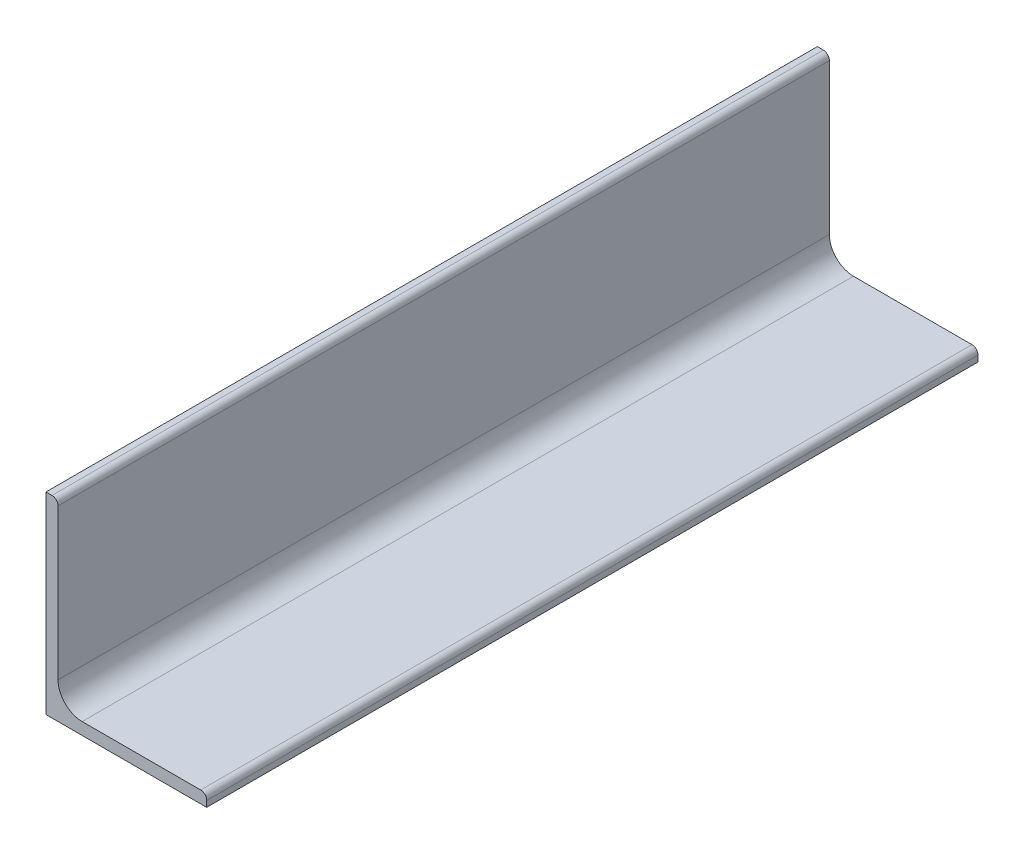
ISO-10303-21;
HEADER;
FILE_DESCRIPTION(('STEP AP214'),'2;1');
FILE_NAME('part.step','',(''),(''),'','','');
FILE_SCHEMA(('AUTOMOTIVE_DESIGN { 1 0 10303 214 1 1 1 1 }'));
ENDSEC;
DATA;
#1=APPLICATION_CONTEXT('core data for automotive mechanical design processes');
#2=APPLICATION_PROTOCOL_DEFINITION('international standard','automotive_design',2000,#1);
#3=PRODUCT_CONTEXT('',#1,'mechanical');
#4=PRODUCT('Part','Part','',(#3));
#5=PRODUCT_RELATED_PRODUCT_CATEGORY('part','',(#4));
#6=PRODUCT_DEFINITION_FORMATION('','',#4);
#7=PRODUCT_DEFINITION_CONTEXT('part definition',#1,'design');
#8=PRODUCT_DEFINITION('design','',#6,#7);
#9=PRODUCT_DEFINITION_SHAPE('','',#8);
#10=(LENGTH_UNIT() NAMED_UNIT(*) SI_UNIT(.MILLI.,.METRE.));
#11=(NAMED_UNIT(*) PLANE_ANGLE_UNIT() SI_UNIT($,.RADIAN.));
#12=(NAMED_UNIT(*) SI_UNIT($,.STERADIAN.) SOLID_ANGLE_UNIT());
#13=UNCERTAINTY_MEASURE_WITH_UNIT(LENGTH_MEASURE(1.E-05),#10,'distance_accuracy_value','');
#14=(GEOMETRIC_REPRESENTATION_CONTEXT(3) GLOBAL_UNCERTAINTY_ASSIGNED_CONTEXT((#13)) GLOBAL_UNIT_ASSIGNED_CONTEXT((#10,
#11,#12)) REPRESENTATION_CONTEXT('',''));
#15=CARTESIAN_POINT('',(0.,0.,0.));
#16=DIRECTION('',(0.,0.,1.));
#17=DIRECTION('',(1.,0.,0.));
#18=AXIS2_PLACEMENT_3D('',#15,#16,#17);
#19=CARTESIAN_POINT('',(0.897927251325018,76.2882459217981,304.8));
#20=DIRECTION('',(1.,0.,0.));
#21=DIRECTION('',(0.,0.,-1.));
#22=AXIS2_PLACEMENT_3D('',#19,#20,#21);
#23=PLANE('',#22);
#24=DIRECTION('',(0.,-1.,0.));
#25=VECTOR('',#24,1.);
#26=CARTESIAN_POINT('',(0.897927251325018,76.2882459217981,0.));
#27=LINE('',#26,#25);
#28=CARTESIAN_POINT('',(0.897927251325018,76.2882459217981,0.));
#29=VERTEX_POINT('',#28);
#30=CARTESIAN_POINT('',(0.897927251325018,0.0882459217980795,0.));
#31=VERTEX_POINT('',#30);
#32=EDGE_CURVE('E135',#29,#31,#27,.T.);
#33=ORIENTED_EDGE('',*,*,#32,.T.);
#34=DIRECTION('',(0.,0.,-1.));
#35=VECTOR('',#34,1.);
#36=CARTESIAN_POINT('',(0.897927251325018,0.0882459217980795,304.8));
#37=LINE('',#36,#35);
#38=CARTESIAN_POINT('',(0.897927251325018,0.0882459217980795,304.8));
#39=VERTEX_POINT('',#38);
#40=EDGE_CURVE('E11',#39,#31,#37,.T.);
#41=ORIENTED_EDGE('',*,*,#40,.F.);
#42=DIRECTION('',(0.,-1.,0.));
#43=VECTOR('',#42,1.);
#44=CARTESIAN_POINT('',(0.897927251325018,76.2882459217981,304.8));
#45=LINE('',#44,#43);
#46=CARTESIAN_POINT('',(0.897927251325018,76.2882459217981,304.8));
#47=VERTEX_POINT('',#46);
#48=EDGE_CURVE('E151',#47,#39,#45,.T.);
#49=ORIENTED_EDGE('',*,*,#48,.F.);
#50=DIRECTION('',(0.,0.,-1.));
#51=VECTOR('',#50,1.);
#52=CARTESIAN_POINT('',(0.897927251325018,76.2882459217981,304.8));
#53=LINE('',#52,#51);
#54=EDGE_CURVE('E131',#47,#29,#53,.T.);
#55=ORIENTED_EDGE('',*,*,#54,.T.);
#56=EDGE_LOOP('',(#33,#41,#49,#55));
#57=FACE_BOUND('',#56,.T.);
#58=ADVANCED_FACE('F33',(#57),#23,.F.);
#59=CARTESIAN_POINT('',(0.897927251325018,0.0882459217980795,304.8));
#60=DIRECTION('',(0.,1.,0.));
#61=DIRECTION('',(0.,0.,1.));
#62=AXIS2_PLACEMENT_3D('',#59,#60,#61);
#63=PLANE('',#62);
#64=DIRECTION('',(1.,0.,0.));
#65=VECTOR('',#64,1.);
#66=CARTESIAN_POINT('',(0.897927251325018,0.0882459217980795,0.));
#67=LINE('',#66,#65);
#68=CARTESIAN_POINT('',(64.397927251325,0.0882459217980795,0.));
#69=VERTEX_POINT('',#68);
#70=EDGE_CURVE('E138',#31,#69,#67,.T.);
#71=ORIENTED_EDGE('',*,*,#70,.T.);
#72=DIRECTION('',(0.,0.,-1.));
#73=VECTOR('',#72,1.);
#74=CARTESIAN_POINT('',(64.397927251325,0.0882459217980795,304.8));
#75=LINE('',#74,#73);
#76=CARTESIAN_POINT('',(64.397927251325,0.0882459217980795,304.8));
#77=VERTEX_POINT('',#76);
#78=EDGE_CURVE('E41',#77,#69,#75,.T.);
#79=ORIENTED_EDGE('',*,*,#78,.F.);
#80=DIRECTION('',(1.,0.,0.));
#81=VECTOR('',#80,1.);
#82=CARTESIAN_POINT('',(0.897927251325018,0.0882459217980795,304.8));
#83=LINE('',#82,#81);
#84=EDGE_CURVE('E95',#39,#77,#83,.T.);
#85=ORIENTED_EDGE('',*,*,#84,.F.);
#86=ORIENTED_EDGE('',*,*,#40,.T.);
#87=EDGE_LOOP('',(#71,#79,#85,#86));
#88=FACE_BOUND('',#87,.T.);
#89=ADVANCED_FACE('F194',(#88),#63,.F.);
#90=CARTESIAN_POINT('',(64.397927251325,0.0882459217980795,304.8));
#91=DIRECTION('',(-1.,0.,0.));
#92=DIRECTION('',(0.,0.,1.));
#93=AXIS2_PLACEMENT_3D('',#90,#91,#92);
#94=PLANE('',#93);
#95=DIRECTION('',(0.,1.,0.));
#96=VECTOR('',#95,1.);
#97=CARTESIAN_POINT('',(64.397927251325,0.0882459217980795,0.));
#98=LINE('',#97,#96);
#99=CARTESIAN_POINT('',(64.397927251325,2.46949592179808,0.));
#100=VERTEX_POINT('',#99);
#101=EDGE_CURVE('E140',#69,#100,#98,.T.);
#102=ORIENTED_EDGE('',*,*,#101,.T.);
#103=DIRECTION('',(0.,0.,-1.));
#104=VECTOR('',#103,1.);
#105=CARTESIAN_POINT('',(64.397927251325,2.46949592179808,304.8));
#106=LINE('',#105,#104);
#107=CARTESIAN_POINT('',(64.397927251325,2.46949592179808,304.8));
#108=VERTEX_POINT('',#107);
#109=EDGE_CURVE('E161',#108,#100,#106,.T.);
#110=ORIENTED_EDGE('',*,*,#109,.F.);
#111=DIRECTION('',(0.,1.,0.));
#112=VECTOR('',#111,1.);
#113=CARTESIAN_POINT('',(64.397927251325,0.0882459217980795,304.8));
#114=LINE('',#113,#112);
#115=EDGE_CURVE('E169',#77,#108,#114,.T.);
#116=ORIENTED_EDGE('',*,*,#115,.F.);
#117=ORIENTED_EDGE('',*,*,#78,.T.);
#118=EDGE_LOOP('',(#102,#110,#116,#117));
#119=FACE_BOUND('',#118,.T.);
#120=ADVANCED_FACE('F167',(#119),#94,.F.);
#121=CARTESIAN_POINT('',(62.016677251325,2.46949592179808,304.8));
#122=DIRECTION('',(0.,0.,-1.));
#123=DIRECTION('',(-1.,0.,0.));
#124=AXIS2_PLACEMENT_3D('',#121,#122,#123);
#125=CYLINDRICAL_SURFACE('',#124,2.38125);
#126=CARTESIAN_POINT('',(62.016677251325,2.46949592179808,0.));
#127=DIRECTION('',(0.,0.,1.));
#128=DIRECTION('',(1.,0.,0.));
#129=AXIS2_PLACEMENT_3D('',#126,#127,#128);
#130=CIRCLE('',#129,2.38125);
#131=CARTESIAN_POINT('',(62.016677251325,4.85074592179808,0.));
#132=VERTEX_POINT('',#131);
#133=EDGE_CURVE('E142',#100,#132,#130,.T.);
#134=ORIENTED_EDGE('',*,*,#133,.T.);
#135=DIRECTION('',(0.,0.,-1.));
#136=VECTOR('',#135,1.);
#137=CARTESIAN_POINT('',(62.016677251325,4.85074592179808,304.8));
#138=LINE('',#137,#136);
#139=CARTESIAN_POINT('',(62.016677251325,4.85074592179808,304.8));
#140=VERTEX_POINT('',#139);
#141=EDGE_CURVE('E158',#140,#132,#138,.T.);
#142=ORIENTED_EDGE('',*,*,#141,.F.);
#143=CARTESIAN_POINT('',(62.016677251325,2.46949592179808,304.8));
#144=DIRECTION('',(0.,0.,1.));
#145=DIRECTION('',(1.,0.,0.));
#146=AXIS2_PLACEMENT_3D('',#143,#144,#145);
#147=CIRCLE('',#146,2.38125);
#148=EDGE_CURVE('E185',#108,#140,#147,.T.);
#149=ORIENTED_EDGE('',*,*,#148,.F.);
#150=ORIENTED_EDGE('',*,*,#109,.T.);
#151=EDGE_LOOP('',(#134,#142,#149,#150));
#152=FACE_BOUND('',#151,.T.);
#153=ADVANCED_FACE('F178',(#152),#125,.T.);
#154=CARTESIAN_POINT('',(62.016677251325,4.85074592179808,304.8));
#155=DIRECTION('',(0.,-1.,0.));
#156=DIRECTION('',(0.,0.,-1.));
#157=AXIS2_PLACEMENT_3D('',#154,#155,#156);
#158=PLANE('',#157);
#159=DIRECTION('',(-1.,0.,0.));
#160=VECTOR('',#159,1.);
#161=CARTESIAN_POINT('',(62.016677251325,4.85074592179808,0.));
#162=LINE('',#161,#160);
#163=CARTESIAN_POINT('',(15.185427251325,4.85074592179808,0.));
#164=VERTEX_POINT('',#163);
#165=EDGE_CURVE('E144',#132,#164,#162,.T.);
#166=ORIENTED_EDGE('',*,*,#165,.T.);
#167=DIRECTION('',(0.,0.,-1.));
#168=VECTOR('',#167,1.);
#169=CARTESIAN_POINT('',(15.185427251325,4.85074592179808,304.8));
#170=LINE('',#169,#168);
#171=CARTESIAN_POINT('',(15.185427251325,4.85074592179808,304.8));
#172=VERTEX_POINT('',#171);
#173=EDGE_CURVE('E155',#172,#164,#170,.T.);
#174=ORIENTED_EDGE('',*,*,#173,.F.);
#175=DIRECTION('',(-1.,0.,0.));
#176=VECTOR('',#175,1.);
#177=CARTESIAN_POINT('',(62.016677251325,4.85074592179808,304.8));
#178=LINE('',#177,#176);
#179=EDGE_CURVE('E184',#140,#172,#178,.T.);
#180=ORIENTED_EDGE('',*,*,#179,.F.);
#181=ORIENTED_EDGE('',*,*,#141,.T.);
#182=EDGE_LOOP('',(#166,#174,#180,#181));
#183=FACE_BOUND('',#182,.T.);
#184=ADVANCED_FACE('F182',(#183),#158,.F.);
#185=CARTESIAN_POINT('',(15.185427251325,14.3757459217981,304.8));
#186=DIRECTION('',(0.,0.,-1.));
#187=DIRECTION('',(-1.,0.,0.));
#188=AXIS2_PLACEMENT_3D('',#185,#186,#187);
#189=CYLINDRICAL_SURFACE('',#188,9.52499999999998);
#190=CARTESIAN_POINT('',(15.185427251325,14.3757459217981,0.));
#191=DIRECTION('',(0.,0.,-1.));
#192=DIRECTION('',(1.,0.,0.));
#193=AXIS2_PLACEMENT_3D('',#190,#191,#192);
#194=CIRCLE('',#193,9.52499999999998);
#195=CARTESIAN_POINT('',(5.66042725132502,14.3757459217981,0.));
#196=VERTEX_POINT('',#195);
#197=EDGE_CURVE('E146',#164,#196,#194,.T.);
#198=ORIENTED_EDGE('',*,*,#197,.T.);
#199=DIRECTION('',(0.,0.,-1.));
#200=VECTOR('',#199,1.);
#201=CARTESIAN_POINT('',(5.66042725132502,14.3757459217981,304.8));
#202=LINE('',#201,#200);
#203=CARTESIAN_POINT('',(5.66042725132502,14.3757459217981,304.8));
#204=VERTEX_POINT('',#203);
#205=EDGE_CURVE('E126',#204,#196,#202,.T.);
#206=ORIENTED_EDGE('',*,*,#205,.F.);
#207=CARTESIAN_POINT('',(15.185427251325,14.3757459217981,304.8));
#208=DIRECTION('',(0.,0.,-1.));
#209=DIRECTION('',(1.,0.,0.));
#210=AXIS2_PLACEMENT_3D('',#207,#208,#209);
#211=CIRCLE('',#210,9.52499999999998);
#212=EDGE_CURVE('E117',#172,#204,#211,.T.);
#213=ORIENTED_EDGE('',*,*,#212,.F.);
#214=ORIENTED_EDGE('',*,*,#173,.T.);
#215=EDGE_LOOP('',(#198,#206,#213,#214));
#216=FACE_BOUND('',#215,.T.);
#217=ADVANCED_FACE('F206',(#216),#189,.F.);
#218=CARTESIAN_POINT('',(5.66042725132502,14.3757459217981,304.8));
#219=DIRECTION('',(-1.,0.,0.));
#220=DIRECTION('',(0.,0.,1.));
#221=AXIS2_PLACEMENT_3D('',#218,#219,#220);
#222=PLANE('',#221);
#223=DIRECTION('',(0.,1.,0.));
#224=VECTOR('',#223,1.);
#225=CARTESIAN_POINT('',(5.66042725132502,14.3757459217981,0.));
#226=LINE('',#225,#224);
#227=CARTESIAN_POINT('',(5.66042725132502,73.9069959217981,0.));
#228=VERTEX_POINT('',#227);
#229=EDGE_CURVE('E125',#196,#228,#226,.T.);
#230=ORIENTED_EDGE('',*,*,#229,.T.);
#231=DIRECTION('',(0.,0.,-1.));
#232=VECTOR('',#231,1.);
#233=CARTESIAN_POINT('',(5.66042725132502,73.9069959217981,304.8));
#234=LINE('',#233,#232);
#235=CARTESIAN_POINT('',(5.66042725132502,73.9069959217981,304.8));
#236=VERTEX_POINT('',#235);
#237=EDGE_CURVE('E122',#236,#228,#234,.T.);
#238=ORIENTED_EDGE('',*,*,#237,.F.);
#239=DIRECTION('',(0.,1.,0.));
#240=VECTOR('',#239,1.);
#241=CARTESIAN_POINT('',(5.66042725132502,14.3757459217981,304.8));
#242=LINE('',#241,#240);
#243=EDGE_CURVE('E111',#204,#236,#242,.T.);
#244=ORIENTED_EDGE('',*,*,#243,.F.);
#245=ORIENTED_EDGE('',*,*,#205,.T.);
#246=EDGE_LOOP('',(#230,#238,#244,#245));
#247=FACE_BOUND('',#246,.T.);
#248=ADVANCED_FACE('F123',(#247),#222,.F.);
#249=CARTESIAN_POINT('',(3.27917725132502,73.9069959217981,304.8));
#250=DIRECTION('',(0.,0.,-1.));
#251=DIRECTION('',(-1.,0.,0.));
#252=AXIS2_PLACEMENT_3D('',#249,#250,#251);
#253=CYLINDRICAL_SURFACE('',#252,2.38125);
#254=CARTESIAN_POINT('',(3.27917725132502,73.9069959217981,0.));
#255=DIRECTION('',(0.,0.,1.));
#256=DIRECTION('',(1.,0.,0.));
#257=AXIS2_PLACEMENT_3D('',#254,#255,#256);
#258=CIRCLE('',#257,2.38125);
#259=CARTESIAN_POINT('',(3.27917725132502,76.2882459217981,0.));
#260=VERTEX_POINT('',#259);
#261=EDGE_CURVE('E81',#228,#260,#258,.T.);
#262=ORIENTED_EDGE('',*,*,#261,.T.);
#263=DIRECTION('',(0.,0.,-1.));
#264=VECTOR('',#263,1.);
#265=CARTESIAN_POINT('',(3.27917725132502,76.2882459217981,304.8));
#266=LINE('',#265,#264);
#267=CARTESIAN_POINT('',(3.27917725132502,76.2882459217981,304.8));
#268=VERTEX_POINT('',#267);
#269=EDGE_CURVE('E127',#268,#260,#266,.T.);
#270=ORIENTED_EDGE('',*,*,#269,.F.);
#271=CARTESIAN_POINT('',(3.27917725132502,73.9069959217981,304.8));
#272=DIRECTION('',(0.,0.,1.));
#273=DIRECTION('',(1.,0.,0.));
#274=AXIS2_PLACEMENT_3D('',#271,#272,#273);
#275=CIRCLE('',#274,2.38125);
#276=EDGE_CURVE('E115',#236,#268,#275,.T.);
#277=ORIENTED_EDGE('',*,*,#276,.F.);
#278=ORIENTED_EDGE('',*,*,#237,.T.);
#279=EDGE_LOOP('',(#262,#270,#277,#278));
#280=FACE_BOUND('',#279,.T.);
#281=ADVANCED_FACE('F129',(#280),#253,.T.);
#282=CARTESIAN_POINT('',(3.27917725132502,76.2882459217981,304.8));
#283=DIRECTION('',(0.,-1.,0.));
#284=DIRECTION('',(0.,0.,-1.));
#285=AXIS2_PLACEMENT_3D('',#282,#283,#284);
#286=PLANE('',#285);
#287=DIRECTION('',(-1.,0.,0.));
#288=VECTOR('',#287,1.);
#289=CARTESIAN_POINT('',(3.27917725132502,76.2882459217981,0.));
#290=LINE('',#289,#288);
#291=EDGE_CURVE('E87',#260,#29,#290,.T.);
#292=ORIENTED_EDGE('',*,*,#291,.T.);
#293=ORIENTED_EDGE('',*,*,#54,.F.);
#294=DIRECTION('',(-1.,0.,0.));
#295=VECTOR('',#294,1.);
#296=CARTESIAN_POINT('',(3.27917725132502,76.2882459217981,304.8));
#297=LINE('',#296,#295);
#298=EDGE_CURVE('E49',#268,#47,#297,.T.);
#299=ORIENTED_EDGE('',*,*,#298,.F.);
#300=ORIENTED_EDGE('',*,*,#269,.T.);
#301=EDGE_LOOP('',(#292,#293,#299,#300));
#302=FACE_BOUND('',#301,.T.);
#303=ADVANCED_FACE('F214',(#302),#286,.F.);
#304=CARTESIAN_POINT('',(62.016677251325,2.46949592179808,304.8));
#305=DIRECTION('',(0.,0.,1.));
#306=DIRECTION('',(1.,0.,0.));
#307=AXIS2_PLACEMENT_3D('',#304,#305,#306);
#308=PLANE('',#307);
#309=ORIENTED_EDGE('',*,*,#48,.T.);
#310=ORIENTED_EDGE('',*,*,#84,.T.);
#311=ORIENTED_EDGE('',*,*,#115,.T.);
#312=ORIENTED_EDGE('',*,*,#148,.T.);
#313=ORIENTED_EDGE('',*,*,#179,.T.);
#314=ORIENTED_EDGE('',*,*,#212,.T.);
#315=ORIENTED_EDGE('',*,*,#243,.T.);
#316=ORIENTED_EDGE('',*,*,#276,.T.);
#317=ORIENTED_EDGE('',*,*,#298,.T.);
#318=EDGE_LOOP('',(#309,#310,#311,#312,#313,#314,#315,#316,#317));
#319=FACE_BOUND('',#318,.T.);
#320=ADVANCED_FACE('F113',(#319),#308,.T.);
#321=CARTESIAN_POINT('',(62.016677251325,2.46949592179808,0.));
#322=DIRECTION('',(0.,0.,1.));
#323=DIRECTION('',(1.,0.,0.));
#324=AXIS2_PLACEMENT_3D('',#321,#322,#323);
#325=PLANE('',#324);
#326=ORIENTED_EDGE('',*,*,#32,.F.);
#327=ORIENTED_EDGE('',*,*,#291,.F.);
#328=ORIENTED_EDGE('',*,*,#261,.F.);
#329=ORIENTED_EDGE('',*,*,#229,.F.);
#330=ORIENTED_EDGE('',*,*,#197,.F.);
#331=ORIENTED_EDGE('',*,*,#165,.F.);
#332=ORIENTED_EDGE('',*,*,#133,.F.);
#333=ORIENTED_EDGE('',*,*,#101,.F.);
#334=ORIENTED_EDGE('',*,*,#70,.F.);
#335=EDGE_LOOP('',(#326,#327,#328,#329,#330,#331,#332,#333,#334));
#336=FACE_BOUND('',#335,.T.);
#337=ADVANCED_FACE('F173',(#336),#325,.F.);
#338=CLOSED_SHELL('',(#58,#89,#120,#153,#184,#217,#248,#281,#303,#320,#337));
#339=MANIFOLD_SOLID_BREP('B2',#338);
#340=ADVANCED_BREP_SHAPE_REPRESENTATION('',(#18,#339),#14);
#341=SHAPE_DEFINITION_REPRESENTATION(#9,#340);
ENDSEC;
END-ISO-10303-21;
